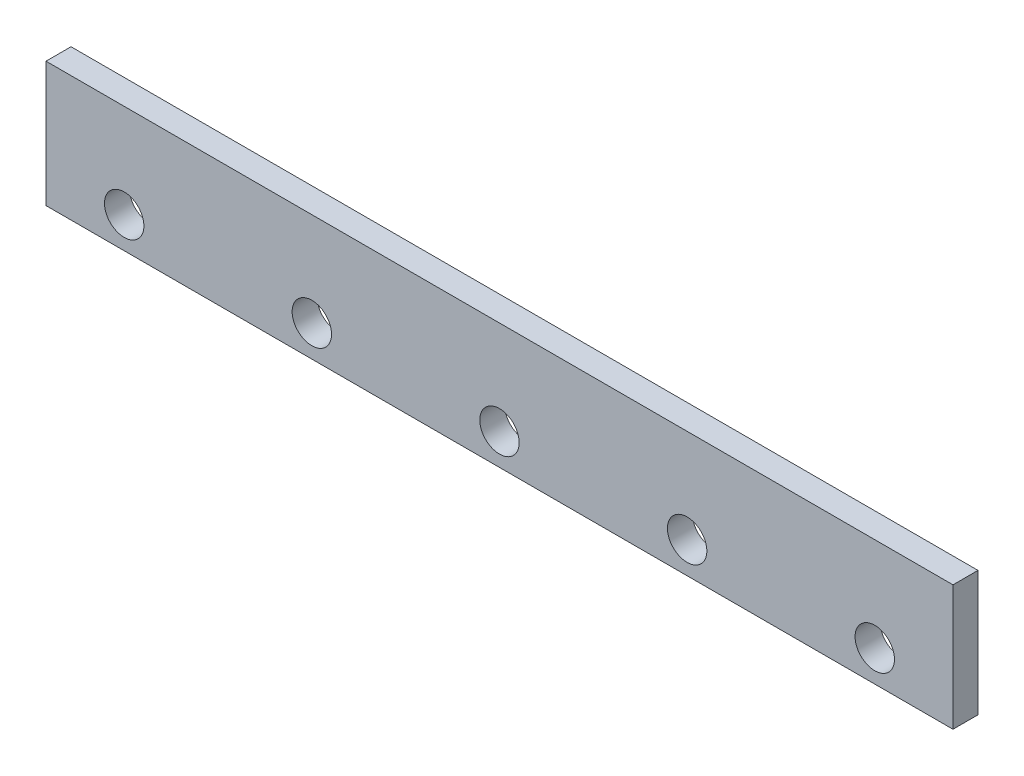
ISO-10303-21;
HEADER;
FILE_DESCRIPTION(('STEP AP214'),'2;1');
FILE_NAME('part.step','',(''),(''),'','','');
FILE_SCHEMA(('AUTOMOTIVE_DESIGN { 1 0 10303 214 1 1 1 1 }'));
ENDSEC;
DATA;
#1=APPLICATION_CONTEXT('core data for automotive mechanical design processes');
#2=APPLICATION_PROTOCOL_DEFINITION('international standard','automotive_design',2000,#1);
#3=PRODUCT_CONTEXT('',#1,'mechanical');
#4=PRODUCT('Part','Part','',(#3));
#5=PRODUCT_RELATED_PRODUCT_CATEGORY('part','',(#4));
#6=PRODUCT_DEFINITION_FORMATION('','',#4);
#7=PRODUCT_DEFINITION_CONTEXT('part definition',#1,'design');
#8=PRODUCT_DEFINITION('design','',#6,#7);
#9=PRODUCT_DEFINITION_SHAPE('','',#8);
#10=(LENGTH_UNIT() NAMED_UNIT(*) SI_UNIT(.MILLI.,.METRE.));
#11=(NAMED_UNIT(*) PLANE_ANGLE_UNIT() SI_UNIT($,.RADIAN.));
#12=(NAMED_UNIT(*) SI_UNIT($,.STERADIAN.) SOLID_ANGLE_UNIT());
#13=UNCERTAINTY_MEASURE_WITH_UNIT(LENGTH_MEASURE(1.E-05),#10,'distance_accuracy_value','');
#14=(GEOMETRIC_REPRESENTATION_CONTEXT(3) GLOBAL_UNCERTAINTY_ASSIGNED_CONTEXT((#13)) GLOBAL_UNIT_ASSIGNED_CONTEXT((#10,
#11,#12)) REPRESENTATION_CONTEXT('',''));
#15=CARTESIAN_POINT('',(0.,0.,0.));
#16=DIRECTION('',(0.,0.,1.));
#17=DIRECTION('',(1.,0.,0.));
#18=AXIS2_PLACEMENT_3D('',#15,#16,#17);
#19=CARTESIAN_POINT('',(-290.,-40.0000000000001,8.));
#20=DIRECTION('',(1.,0.,0.));
#21=DIRECTION('',(0.,0.,-1.));
#22=AXIS2_PLACEMENT_3D('',#19,#20,#21);
#23=PLANE('',#22);
#24=DIRECTION('',(0.,-1.,0.));
#25=VECTOR('',#24,1.);
#26=CARTESIAN_POINT('',(-290.,-40.0000000000001,-8.));
#27=LINE('',#26,#25);
#28=CARTESIAN_POINT('',(-290.,39.9999999999999,-8.));
#29=VERTEX_POINT('',#28);
#30=CARTESIAN_POINT('',(-290.,-40.0000000000001,-8.));
#31=VERTEX_POINT('',#30);
#32=EDGE_CURVE('E107',#29,#31,#27,.T.);
#33=ORIENTED_EDGE('',*,*,#32,.T.);
#34=DIRECTION('',(0.,0.,-1.));
#35=VECTOR('',#34,1.);
#36=CARTESIAN_POINT('',(-290.,-40.0000000000001,8.));
#37=LINE('',#36,#35);
#38=CARTESIAN_POINT('',(-290.,-40.0000000000001,8.));
#39=VERTEX_POINT('',#38);
#40=EDGE_CURVE('E11',#39,#31,#37,.T.);
#41=ORIENTED_EDGE('',*,*,#40,.F.);
#42=DIRECTION('',(0.,-1.,0.));
#43=VECTOR('',#42,1.);
#44=CARTESIAN_POINT('',(-290.,-40.0000000000001,8.));
#45=LINE('',#44,#43);
#46=CARTESIAN_POINT('',(-290.,39.9999999999999,8.));
#47=VERTEX_POINT('',#46);
#48=EDGE_CURVE('E91',#47,#39,#45,.T.);
#49=ORIENTED_EDGE('',*,*,#48,.F.);
#50=DIRECTION('',(0.,0.,-1.));
#51=VECTOR('',#50,1.);
#52=CARTESIAN_POINT('',(-290.,39.9999999999999,8.));
#53=LINE('',#52,#51);
#54=EDGE_CURVE('E103',#47,#29,#53,.T.);
#55=ORIENTED_EDGE('',*,*,#54,.T.);
#56=EDGE_LOOP('',(#33,#41,#49,#55));
#57=FACE_BOUND('',#56,.T.);
#58=ADVANCED_FACE('F39',(#57),#23,.F.);
#59=CARTESIAN_POINT('',(290.,-40.,8.));
#60=DIRECTION('',(0.,1.,0.));
#61=DIRECTION('',(-1.,0.,0.));
#62=AXIS2_PLACEMENT_3D('',#59,#60,#61);
#63=PLANE('',#62);
#64=DIRECTION('',(1.,0.,0.));
#65=VECTOR('',#64,1.);
#66=CARTESIAN_POINT('',(290.,-40.,-8.));
#67=LINE('',#66,#65);
#68=CARTESIAN_POINT('',(290.,-40.,-8.));
#69=VERTEX_POINT('',#68);
#70=EDGE_CURVE('E96',#31,#69,#67,.T.);
#71=ORIENTED_EDGE('',*,*,#70,.T.);
#72=DIRECTION('',(0.,0.,-1.));
#73=VECTOR('',#72,1.);
#74=CARTESIAN_POINT('',(290.,-40.,8.));
#75=LINE('',#74,#73);
#76=CARTESIAN_POINT('',(290.,-40.,8.));
#77=VERTEX_POINT('',#76);
#78=EDGE_CURVE('E48',#77,#69,#75,.T.);
#79=ORIENTED_EDGE('',*,*,#78,.F.);
#80=DIRECTION('',(1.,0.,0.));
#81=VECTOR('',#80,1.);
#82=CARTESIAN_POINT('',(290.,-40.,8.));
#83=LINE('',#82,#81);
#84=EDGE_CURVE('E86',#39,#77,#83,.T.);
#85=ORIENTED_EDGE('',*,*,#84,.F.);
#86=ORIENTED_EDGE('',*,*,#40,.T.);
#87=EDGE_LOOP('',(#71,#79,#85,#86));
#88=FACE_BOUND('',#87,.T.);
#89=ADVANCED_FACE('F95',(#88),#63,.F.);
#90=CARTESIAN_POINT('',(290.,-40.,8.));
#91=DIRECTION('',(-1.,0.,0.));
#92=DIRECTION('',(0.,0.,1.));
#93=AXIS2_PLACEMENT_3D('',#90,#91,#92);
#94=PLANE('',#93);
#95=DIRECTION('',(0.,1.,0.));
#96=VECTOR('',#95,1.);
#97=CARTESIAN_POINT('',(290.,-40.,-8.));
#98=LINE('',#97,#96);
#99=CARTESIAN_POINT('',(290.,40.,-8.));
#100=VERTEX_POINT('',#99);
#101=EDGE_CURVE('E73',#69,#100,#98,.T.);
#102=ORIENTED_EDGE('',*,*,#101,.T.);
#103=DIRECTION('',(0.,0.,-1.));
#104=VECTOR('',#103,1.);
#105=CARTESIAN_POINT('',(290.,40.,8.));
#106=LINE('',#105,#104);
#107=CARTESIAN_POINT('',(290.,40.,8.));
#108=VERTEX_POINT('',#107);
#109=EDGE_CURVE('E98',#108,#100,#106,.T.);
#110=ORIENTED_EDGE('',*,*,#109,.F.);
#111=DIRECTION('',(0.,1.,0.));
#112=VECTOR('',#111,1.);
#113=CARTESIAN_POINT('',(290.,-40.,8.));
#114=LINE('',#113,#112);
#115=EDGE_CURVE('E89',#77,#108,#114,.T.);
#116=ORIENTED_EDGE('',*,*,#115,.F.);
#117=ORIENTED_EDGE('',*,*,#78,.T.);
#118=EDGE_LOOP('',(#102,#110,#116,#117));
#119=FACE_BOUND('',#118,.T.);
#120=ADVANCED_FACE('F99',(#119),#94,.F.);
#121=CARTESIAN_POINT('',(290.,40.,8.));
#122=DIRECTION('',(0.,-1.,0.));
#123=DIRECTION('',(1.,0.,0.));
#124=AXIS2_PLACEMENT_3D('',#121,#122,#123);
#125=PLANE('',#124);
#126=DIRECTION('',(-1.,0.,0.));
#127=VECTOR('',#126,1.);
#128=CARTESIAN_POINT('',(290.,40.,-8.));
#129=LINE('',#128,#127);
#130=EDGE_CURVE('E79',#100,#29,#129,.T.);
#131=ORIENTED_EDGE('',*,*,#130,.T.);
#132=ORIENTED_EDGE('',*,*,#54,.F.);
#133=DIRECTION('',(-1.,0.,0.));
#134=VECTOR('',#133,1.);
#135=CARTESIAN_POINT('',(290.,40.,8.));
#136=LINE('',#135,#134);
#137=EDGE_CURVE('E56',#108,#47,#136,.T.);
#138=ORIENTED_EDGE('',*,*,#137,.F.);
#139=ORIENTED_EDGE('',*,*,#109,.T.);
#140=EDGE_LOOP('',(#131,#132,#138,#139));
#141=FACE_BOUND('',#140,.T.);
#142=ADVANCED_FACE('F121',(#141),#125,.F.);
#143=CARTESIAN_POINT('',(0.,0.,8.));
#144=DIRECTION('',(0.,0.,1.));
#145=DIRECTION('',(1.,0.,0.));
#146=AXIS2_PLACEMENT_3D('',#143,#144,#145);
#147=PLANE('',#146);
#148=CARTESIAN_POINT('',(-240.,-20.0000000000001,8.));
#149=DIRECTION('',(0.,0.,1.));
#150=DIRECTION('',(1.,0.,0.));
#151=AXIS2_PLACEMENT_3D('',#148,#149,#150);
#152=CIRCLE('',#151,12.6);
#153=CARTESIAN_POINT('',(-227.4,-20.0000000000001,8.));
#154=VERTEX_POINT('',#153);
#155=EDGE_CURVE('E160',#154,#154,#152,.T.);
#156=ORIENTED_EDGE('',*,*,#155,.F.);
#157=EDGE_LOOP('',(#156));
#158=FACE_BOUND('',#157,.T.);
#159=CARTESIAN_POINT('',(0.,-20.0000000000001,8.));
#160=DIRECTION('',(0.,0.,1.));
#161=DIRECTION('',(1.,0.,0.));
#162=AXIS2_PLACEMENT_3D('',#159,#160,#161);
#163=CIRCLE('',#162,12.6);
#164=CARTESIAN_POINT('',(12.6000000000001,-20.0000000000001,8.));
#165=VERTEX_POINT('',#164);
#166=EDGE_CURVE('E152',#165,#165,#163,.T.);
#167=ORIENTED_EDGE('',*,*,#166,.F.);
#168=EDGE_LOOP('',(#167));
#169=FACE_BOUND('',#168,.T.);
#170=CARTESIAN_POINT('',(-120.,-20.0000000000001,8.));
#171=DIRECTION('',(0.,0.,1.));
#172=DIRECTION('',(1.,0.,0.));
#173=AXIS2_PLACEMENT_3D('',#170,#171,#172);
#174=CIRCLE('',#173,12.6);
#175=CARTESIAN_POINT('',(-107.4,-20.0000000000001,8.));
#176=VERTEX_POINT('',#175);
#177=EDGE_CURVE('E144',#176,#176,#174,.T.);
#178=ORIENTED_EDGE('',*,*,#177,.F.);
#179=EDGE_LOOP('',(#178));
#180=FACE_BOUND('',#179,.T.);
#181=CARTESIAN_POINT('',(120.,-20.0000000000001,8.));
#182=DIRECTION('',(0.,0.,1.));
#183=DIRECTION('',(-1.,0.,0.));
#184=AXIS2_PLACEMENT_3D('',#181,#182,#183);
#185=CIRCLE('',#184,12.6);
#186=CARTESIAN_POINT('',(107.4,-20.0000000000001,8.));
#187=VERTEX_POINT('',#186);
#188=EDGE_CURVE('E136',#187,#187,#185,.T.);
#189=ORIENTED_EDGE('',*,*,#188,.F.);
#190=EDGE_LOOP('',(#189));
#191=FACE_BOUND('',#190,.T.);
#192=CARTESIAN_POINT('',(240.,-20.0000000000001,8.));
#193=DIRECTION('',(0.,0.,1.));
#194=DIRECTION('',(-1.,0.,0.));
#195=AXIS2_PLACEMENT_3D('',#192,#193,#194);
#196=CIRCLE('',#195,12.6);
#197=CARTESIAN_POINT('',(227.4,-20.0000000000001,8.));
#198=VERTEX_POINT('',#197);
#199=EDGE_CURVE('E128',#198,#198,#196,.T.);
#200=ORIENTED_EDGE('',*,*,#199,.F.);
#201=EDGE_LOOP('',(#200));
#202=FACE_BOUND('',#201,.T.);
#203=ORIENTED_EDGE('',*,*,#48,.T.);
#204=ORIENTED_EDGE('',*,*,#84,.T.);
#205=ORIENTED_EDGE('',*,*,#115,.T.);
#206=ORIENTED_EDGE('',*,*,#137,.T.);
#207=EDGE_LOOP('',(#203,#204,#205,#206));
#208=FACE_BOUND('',#207,.T.);
#209=ADVANCED_FACE('F87',(#158,#169,#180,#191,#202,#208),#147,.T.);
#210=CARTESIAN_POINT('',(0.,0.,-8.));
#211=DIRECTION('',(0.,0.,1.));
#212=DIRECTION('',(1.,0.,0.));
#213=AXIS2_PLACEMENT_3D('',#210,#211,#212);
#214=PLANE('',#213);
#215=CARTESIAN_POINT('',(-240.,-20.0000000000001,-8.));
#216=DIRECTION('',(0.,0.,1.));
#217=DIRECTION('',(1.,0.,0.));
#218=AXIS2_PLACEMENT_3D('',#215,#216,#217);
#219=CIRCLE('',#218,12.6);
#220=CARTESIAN_POINT('',(-227.4,-20.0000000000001,-8.));
#221=VERTEX_POINT('',#220);
#222=EDGE_CURVE('E111',#221,#221,#219,.T.);
#223=ORIENTED_EDGE('',*,*,#222,.T.);
#224=EDGE_LOOP('',(#223));
#225=FACE_BOUND('',#224,.T.);
#226=CARTESIAN_POINT('',(0.,-20.0000000000001,-8.));
#227=DIRECTION('',(0.,0.,1.));
#228=DIRECTION('',(1.,0.,0.));
#229=AXIS2_PLACEMENT_3D('',#226,#227,#228);
#230=CIRCLE('',#229,12.6);
#231=CARTESIAN_POINT('',(12.6000000000001,-20.0000000000001,-8.));
#232=VERTEX_POINT('',#231);
#233=EDGE_CURVE('E156',#232,#232,#230,.T.);
#234=ORIENTED_EDGE('',*,*,#233,.T.);
#235=EDGE_LOOP('',(#234));
#236=FACE_BOUND('',#235,.T.);
#237=CARTESIAN_POINT('',(-120.,-20.0000000000001,-8.));
#238=DIRECTION('',(0.,0.,1.));
#239=DIRECTION('',(1.,0.,0.));
#240=AXIS2_PLACEMENT_3D('',#237,#238,#239);
#241=CIRCLE('',#240,12.6);
#242=CARTESIAN_POINT('',(-107.4,-20.0000000000001,-8.));
#243=VERTEX_POINT('',#242);
#244=EDGE_CURVE('E148',#243,#243,#241,.T.);
#245=ORIENTED_EDGE('',*,*,#244,.T.);
#246=EDGE_LOOP('',(#245));
#247=FACE_BOUND('',#246,.T.);
#248=CARTESIAN_POINT('',(120.,-20.0000000000001,-8.));
#249=DIRECTION('',(0.,0.,1.));
#250=DIRECTION('',(-1.,0.,0.));
#251=AXIS2_PLACEMENT_3D('',#248,#249,#250);
#252=CIRCLE('',#251,12.6);
#253=CARTESIAN_POINT('',(107.4,-20.0000000000001,-8.));
#254=VERTEX_POINT('',#253);
#255=EDGE_CURVE('E140',#254,#254,#252,.T.);
#256=ORIENTED_EDGE('',*,*,#255,.T.);
#257=EDGE_LOOP('',(#256));
#258=FACE_BOUND('',#257,.T.);
#259=CARTESIAN_POINT('',(240.,-20.0000000000001,-8.));
#260=DIRECTION('',(0.,0.,1.));
#261=DIRECTION('',(-1.,0.,0.));
#262=AXIS2_PLACEMENT_3D('',#259,#260,#261);
#263=CIRCLE('',#262,12.6);
#264=CARTESIAN_POINT('',(227.4,-20.0000000000001,-8.));
#265=VERTEX_POINT('',#264);
#266=EDGE_CURVE('E132',#265,#265,#263,.T.);
#267=ORIENTED_EDGE('',*,*,#266,.T.);
#268=EDGE_LOOP('',(#267));
#269=FACE_BOUND('',#268,.T.);
#270=ORIENTED_EDGE('',*,*,#32,.F.);
#271=ORIENTED_EDGE('',*,*,#130,.F.);
#272=ORIENTED_EDGE('',*,*,#101,.F.);
#273=ORIENTED_EDGE('',*,*,#70,.F.);
#274=EDGE_LOOP('',(#270,#271,#272,#273));
#275=FACE_BOUND('',#274,.T.);
#276=ADVANCED_FACE('F124',(#225,#236,#247,#258,#269,#275),#214,.F.);
#277=CARTESIAN_POINT('',(240.,-20.0000000000001,-8.));
#278=DIRECTION('',(0.,0.,1.));
#279=DIRECTION('',(1.,0.,0.));
#280=AXIS2_PLACEMENT_3D('',#277,#278,#279);
#281=CYLINDRICAL_SURFACE('',#280,12.6);
#282=ORIENTED_EDGE('',*,*,#266,.F.);
#283=EDGE_LOOP('',(#282));
#284=FACE_BOUND('',#283,.T.);
#285=ORIENTED_EDGE('',*,*,#199,.T.);
#286=EDGE_LOOP('',(#285));
#287=FACE_BOUND('',#286,.T.);
#288=ADVANCED_FACE('F188',(#284,#287),#281,.F.);
#289=CARTESIAN_POINT('',(120.,-20.0000000000001,-8.));
#290=DIRECTION('',(0.,0.,1.));
#291=DIRECTION('',(1.,0.,0.));
#292=AXIS2_PLACEMENT_3D('',#289,#290,#291);
#293=CYLINDRICAL_SURFACE('',#292,12.6);
#294=ORIENTED_EDGE('',*,*,#255,.F.);
#295=EDGE_LOOP('',(#294));
#296=FACE_BOUND('',#295,.T.);
#297=ORIENTED_EDGE('',*,*,#188,.T.);
#298=EDGE_LOOP('',(#297));
#299=FACE_BOUND('',#298,.T.);
#300=ADVANCED_FACE('F190',(#296,#299),#293,.F.);
#301=CARTESIAN_POINT('',(-120.,-20.0000000000001,-8.));
#302=DIRECTION('',(0.,0.,1.));
#303=DIRECTION('',(1.,0.,0.));
#304=AXIS2_PLACEMENT_3D('',#301,#302,#303);
#305=CYLINDRICAL_SURFACE('',#304,12.6);
#306=ORIENTED_EDGE('',*,*,#244,.F.);
#307=EDGE_LOOP('',(#306));
#308=FACE_BOUND('',#307,.T.);
#309=ORIENTED_EDGE('',*,*,#177,.T.);
#310=EDGE_LOOP('',(#309));
#311=FACE_BOUND('',#310,.T.);
#312=ADVANCED_FACE('F197',(#308,#311),#305,.F.);
#313=CARTESIAN_POINT('',(0.,-20.0000000000001,-8.));
#314=DIRECTION('',(0.,0.,1.));
#315=DIRECTION('',(1.,0.,0.));
#316=AXIS2_PLACEMENT_3D('',#313,#314,#315);
#317=CYLINDRICAL_SURFACE('',#316,12.6);
#318=ORIENTED_EDGE('',*,*,#233,.F.);
#319=EDGE_LOOP('',(#318));
#320=FACE_BOUND('',#319,.T.);
#321=ORIENTED_EDGE('',*,*,#166,.T.);
#322=EDGE_LOOP('',(#321));
#323=FACE_BOUND('',#322,.T.);
#324=ADVANCED_FACE('F173',(#320,#323),#317,.F.);
#325=CARTESIAN_POINT('',(-240.,-20.0000000000001,-8.));
#326=DIRECTION('',(0.,0.,1.));
#327=DIRECTION('',(1.,0.,0.));
#328=AXIS2_PLACEMENT_3D('',#325,#326,#327);
#329=CYLINDRICAL_SURFACE('',#328,12.6);
#330=ORIENTED_EDGE('',*,*,#222,.F.);
#331=EDGE_LOOP('',(#330));
#332=FACE_BOUND('',#331,.T.);
#333=ORIENTED_EDGE('',*,*,#155,.T.);
#334=EDGE_LOOP('',(#333));
#335=FACE_BOUND('',#334,.T.);
#336=ADVANCED_FACE('F170',(#332,#335),#329,.F.);
#337=CLOSED_SHELL('',(#58,#89,#120,#142,#209,#276,#288,#300,#312,#324,#336));
#338=MANIFOLD_SOLID_BREP('B2',#337);
#339=ADVANCED_BREP_SHAPE_REPRESENTATION('',(#18,#338),#14);
#340=SHAPE_DEFINITION_REPRESENTATION(#9,#339);
ENDSEC;
END-ISO-10303-21;
